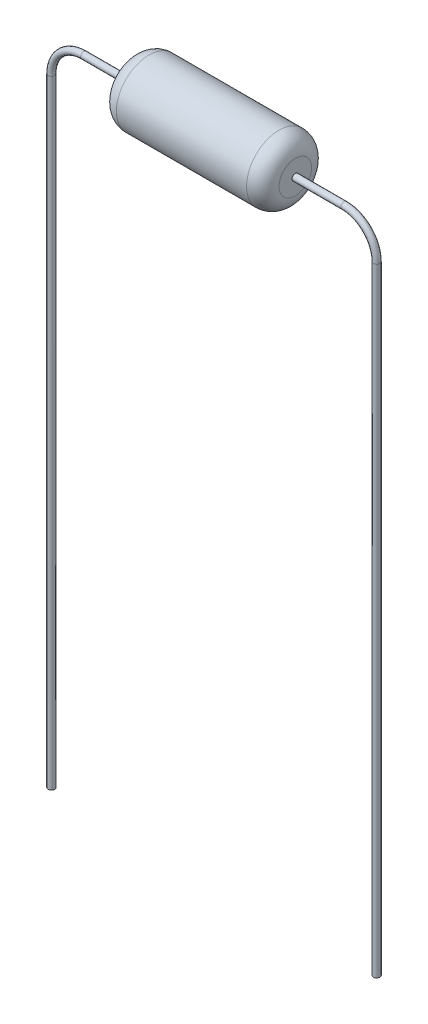
ISO-10303-21;
HEADER;
FILE_DESCRIPTION(('STEP AP214'),'2;1');
FILE_NAME('part.step','',(''),(''),'','','');
FILE_SCHEMA(('AUTOMOTIVE_DESIGN { 1 0 10303 214 1 1 1 1 }'));
ENDSEC;
DATA;
#1=APPLICATION_CONTEXT('core data for automotive mechanical design processes');
#2=APPLICATION_PROTOCOL_DEFINITION('international standard','automotive_design',2000,#1);
#3=PRODUCT_CONTEXT('',#1,'mechanical');
#4=PRODUCT('Part','Part','',(#3));
#5=PRODUCT_RELATED_PRODUCT_CATEGORY('part','',(#4));
#6=PRODUCT_DEFINITION_FORMATION('','',#4);
#7=PRODUCT_DEFINITION_CONTEXT('part definition',#1,'design');
#8=PRODUCT_DEFINITION('design','',#6,#7);
#9=PRODUCT_DEFINITION_SHAPE('','',#8);
#10=(LENGTH_UNIT() NAMED_UNIT(*) SI_UNIT(.MILLI.,.METRE.));
#11=(NAMED_UNIT(*) PLANE_ANGLE_UNIT() SI_UNIT($,.RADIAN.));
#12=(NAMED_UNIT(*) SI_UNIT($,.STERADIAN.) SOLID_ANGLE_UNIT());
#13=UNCERTAINTY_MEASURE_WITH_UNIT(LENGTH_MEASURE(1.E-05),#10,'distance_accuracy_value','');
#14=(GEOMETRIC_REPRESENTATION_CONTEXT(3) GLOBAL_UNCERTAINTY_ASSIGNED_CONTEXT((#13)) GLOBAL_UNIT_ASSIGNED_CONTEXT((#10,
#11,#12)) REPRESENTATION_CONTEXT('',''));
#15=CARTESIAN_POINT('',(0.,0.,0.));
#16=DIRECTION('',(0.,0.,1.));
#17=DIRECTION('',(1.,0.,0.));
#18=AXIS2_PLACEMENT_3D('',#15,#16,#17);
#19=CARTESIAN_POINT('',(-2.5,0.499999999999998,0.));
#20=DIRECTION('',(-1.,0.,0.));
#21=DIRECTION('',(0.,0.,1.));
#22=AXIS2_PLACEMENT_3D('',#19,#20,#21);
#23=PLANE('',#22);
#24=CARTESIAN_POINT('',(-2.5,0.,0.));
#25=DIRECTION('',(-1.,0.,0.));
#26=DIRECTION('',(0.,0.,1.));
#27=AXIS2_PLACEMENT_3D('',#24,#25,#26);
#28=CIRCLE('',#27,0.1);
#29=CARTESIAN_POINT('',(-2.5,0.,0.1));
#30=VERTEX_POINT('',#29);
#31=EDGE_CURVE('E10',#30,#30,#28,.T.);
#32=ORIENTED_EDGE('',*,*,#31,.F.);
#33=EDGE_LOOP('',(#32));
#34=FACE_BOUND('',#33,.T.);
#35=CARTESIAN_POINT('',(-2.5,0.,0.));
#36=DIRECTION('',(1.,0.,0.));
#37=DIRECTION('',(0.,0.,-1.));
#38=AXIS2_PLACEMENT_3D('',#35,#36,#37);
#39=CIRCLE('',#38,0.499999999999998);
#40=CARTESIAN_POINT('',(-2.5,0.,-0.499999999999998));
#41=VERTEX_POINT('',#40);
#42=EDGE_CURVE('E49',#41,#41,#39,.T.);
#43=ORIENTED_EDGE('',*,*,#42,.F.);
#44=EDGE_LOOP('',(#43));
#45=FACE_BOUND('',#44,.T.);
#46=ADVANCED_FACE('F37',(#34,#45),#23,.T.);
#47=CARTESIAN_POINT('',(-2.,0.,0.));
#48=DIRECTION('',(1.,0.,0.));
#49=DIRECTION('',(0.,0.,-1.));
#50=AXIS2_PLACEMENT_3D('',#47,#48,#49);
#51=DEGENERATE_TOROIDAL_SURFACE('',#50,0.499999999999998,0.5,.T.);
#52=ORIENTED_EDGE('',*,*,#42,.T.);
#53=EDGE_LOOP('',(#52));
#54=FACE_BOUND('',#53,.T.);
#55=CARTESIAN_POINT('',(-2.,0.,0.));
#56=DIRECTION('',(1.,0.,0.));
#57=DIRECTION('',(0.,0.,-1.));
#58=AXIS2_PLACEMENT_3D('',#55,#56,#57);
#59=CIRCLE('',#58,0.999999999999998);
#60=CARTESIAN_POINT('',(-2.,0.,-0.999999999999998));
#61=VERTEX_POINT('',#60);
#62=EDGE_CURVE('E54',#61,#61,#59,.T.);
#63=ORIENTED_EDGE('',*,*,#62,.F.);
#64=EDGE_LOOP('',(#63));
#65=FACE_BOUND('',#64,.T.);
#66=ADVANCED_FACE('F110',(#54,#65),#51,.T.);
#67=CARTESIAN_POINT('',(15.8505650117618,0.,0.));
#68=DIRECTION('',(1.,0.,0.));
#69=DIRECTION('',(0.,0.,-1.));
#70=AXIS2_PLACEMENT_3D('',#67,#68,#69);
#71=CYLINDRICAL_SURFACE('',#70,0.999999999999998);
#72=ORIENTED_EDGE('',*,*,#62,.T.);
#73=EDGE_LOOP('',(#72));
#74=FACE_BOUND('',#73,.T.);
#75=CARTESIAN_POINT('',(2.,0.,0.));
#76=DIRECTION('',(1.,0.,0.));
#77=DIRECTION('',(0.,0.,-1.));
#78=AXIS2_PLACEMENT_3D('',#75,#76,#77);
#79=CIRCLE('',#78,0.999999999999999);
#80=CARTESIAN_POINT('',(2.,0.,-0.999999999999999));
#81=VERTEX_POINT('',#80);
#82=EDGE_CURVE('E60',#81,#81,#79,.T.);
#83=ORIENTED_EDGE('',*,*,#82,.F.);
#84=EDGE_LOOP('',(#83));
#85=FACE_BOUND('',#84,.T.);
#86=ADVANCED_FACE('F115',(#74,#85),#71,.T.);
#87=CARTESIAN_POINT('',(2.,0.,0.));
#88=DIRECTION('',(1.,0.,0.));
#89=DIRECTION('',(0.,0.,-1.));
#90=AXIS2_PLACEMENT_3D('',#87,#88,#89);
#91=DEGENERATE_TOROIDAL_SURFACE('',#90,0.499999999999998,0.5,.T.);
#92=ORIENTED_EDGE('',*,*,#82,.T.);
#93=EDGE_LOOP('',(#92));
#94=FACE_BOUND('',#93,.T.);
#95=CARTESIAN_POINT('',(2.5,0.,0.));
#96=DIRECTION('',(1.,0.,0.));
#97=DIRECTION('',(0.,0.,-1.));
#98=AXIS2_PLACEMENT_3D('',#95,#96,#97);
#99=CIRCLE('',#98,0.499999999999998);
#100=CARTESIAN_POINT('',(2.5,0.,-0.499999999999998));
#101=VERTEX_POINT('',#100);
#102=EDGE_CURVE('E64',#101,#101,#99,.T.);
#103=ORIENTED_EDGE('',*,*,#102,.F.);
#104=EDGE_LOOP('',(#103));
#105=FACE_BOUND('',#104,.T.);
#106=ADVANCED_FACE('F124',(#94,#105),#91,.T.);
#107=CARTESIAN_POINT('',(2.5,0.,0.));
#108=DIRECTION('',(1.,0.,0.));
#109=DIRECTION('',(0.,0.,-1.));
#110=AXIS2_PLACEMENT_3D('',#107,#108,#109);
#111=PLANE('',#110);
#112=CARTESIAN_POINT('',(2.5,0.,0.));
#113=DIRECTION('',(1.,0.,0.));
#114=DIRECTION('',(0.,0.,-1.));
#115=AXIS2_PLACEMENT_3D('',#112,#113,#114);
#116=CIRCLE('',#115,0.1);
#117=CARTESIAN_POINT('',(2.5,0.,-0.1));
#118=VERTEX_POINT('',#117);
#119=EDGE_CURVE('E44',#118,#118,#116,.T.);
#120=ORIENTED_EDGE('',*,*,#119,.F.);
#121=EDGE_LOOP('',(#120));
#122=FACE_BOUND('',#121,.T.);
#123=ORIENTED_EDGE('',*,*,#102,.T.);
#124=EDGE_LOOP('',(#123));
#125=FACE_BOUND('',#124,.T.);
#126=ADVANCED_FACE('F130',(#122,#125),#111,.T.);
#127=CARTESIAN_POINT('',(5.,-20.,0.));
#128=DIRECTION('',(0.,-1.,0.));
#129=DIRECTION('',(0.,0.,-1.));
#130=AXIS2_PLACEMENT_3D('',#127,#128,#129);
#131=PLANE('',#130);
#132=CARTESIAN_POINT('',(5.,-20.,0.));
#133=DIRECTION('',(0.,-1.,0.));
#134=DIRECTION('',(0.,0.,-1.));
#135=AXIS2_PLACEMENT_3D('',#132,#133,#134);
#136=CIRCLE('',#135,0.1);
#137=CARTESIAN_POINT('',(5.,-20.,-0.1));
#138=VERTEX_POINT('',#137);
#139=EDGE_CURVE('E68',#138,#138,#136,.T.);
#140=ORIENTED_EDGE('',*,*,#139,.T.);
#141=EDGE_LOOP('',(#140));
#142=FACE_BOUND('',#141,.T.);
#143=ADVANCED_FACE('F135',(#142),#131,.T.);
#144=CARTESIAN_POINT('',(2.5,0.,0.));
#145=DIRECTION('',(1.,0.,0.));
#146=DIRECTION('',(0.,1.,0.));
#147=AXIS2_PLACEMENT_3D('',#144,#145,#146);
#148=CYLINDRICAL_SURFACE('',#147,0.1);
#149=CARTESIAN_POINT('',(4.,0.,0.));
#150=DIRECTION('',(1.,0.,0.));
#151=DIRECTION('',(0.,0.,-1.));
#152=AXIS2_PLACEMENT_3D('',#149,#150,#151);
#153=CIRCLE('',#152,0.1);
#154=CARTESIAN_POINT('',(4.,0.0999999999999996,0.));
#155=VERTEX_POINT('',#154);
#156=EDGE_CURVE('E76',#155,#155,#153,.T.);
#157=ORIENTED_EDGE('',*,*,#156,.F.);
#158=EDGE_LOOP('',(#157));
#159=FACE_BOUND('',#158,.T.);
#160=ORIENTED_EDGE('',*,*,#119,.T.);
#161=EDGE_LOOP('',(#160));
#162=FACE_BOUND('',#161,.T.);
#163=ADVANCED_FACE('F141',(#159,#162),#148,.T.);
#164=CARTESIAN_POINT('',(4.,-1.,0.));
#165=DIRECTION('',(0.,0.,-1.));
#166=DIRECTION('',(-1.,0.,0.));
#167=AXIS2_PLACEMENT_3D('',#164,#165,#166);
#168=TOROIDAL_SURFACE('',#167,1.,0.1);
#169=CARTESIAN_POINT('',(5.,-1.,0.));
#170=DIRECTION('',(0.,-1.,0.));
#171=DIRECTION('',(0.,0.,-1.));
#172=AXIS2_PLACEMENT_3D('',#169,#170,#171);
#173=CIRCLE('',#172,0.1);
#174=CARTESIAN_POINT('',(5.1,-1.,0.));
#175=VERTEX_POINT('',#174);
#176=EDGE_CURVE('E72',#175,#175,#173,.T.);
#177=CARTESIAN_POINT('',(4.,-1.,0.));
#178=DIRECTION('',(0.,0.,-1.));
#179=DIRECTION('',(-1.,0.,0.));
#180=AXIS2_PLACEMENT_3D('',#177,#178,#179);
#181=CIRCLE('',#180,1.1);
#182=EDGE_CURVE('',#155,#175,#181,.T.);
#183=ORIENTED_EDGE('',*,*,#156,.T.);
#184=ORIENTED_EDGE('',*,*,#176,.F.);
#185=ORIENTED_EDGE('',*,*,#182,.T.);
#186=ORIENTED_EDGE('',*,*,#182,.F.);
#187=EDGE_LOOP('',(#183,#185,#184,#186));
#188=FACE_BOUND('',#187,.T.);
#189=ADVANCED_FACE('F145',(#188),#168,.T.);
#190=CARTESIAN_POINT('',(5.,-1.,0.));
#191=DIRECTION('',(0.,-1.,0.));
#192=DIRECTION('',(1.,0.,0.));
#193=AXIS2_PLACEMENT_3D('',#190,#191,#192);
#194=CYLINDRICAL_SURFACE('',#193,0.1);
#195=ORIENTED_EDGE('',*,*,#139,.F.);
#196=EDGE_LOOP('',(#195));
#197=FACE_BOUND('',#196,.T.);
#198=ORIENTED_EDGE('',*,*,#176,.T.);
#199=EDGE_LOOP('',(#198));
#200=FACE_BOUND('',#199,.T.);
#201=ADVANCED_FACE('F106',(#197,#200),#194,.T.);
#202=CARTESIAN_POINT('',(-5.,-20.,0.));
#203=DIRECTION('',(0.,-1.,0.));
#204=DIRECTION('',(0.,0.,-1.));
#205=AXIS2_PLACEMENT_3D('',#202,#203,#204);
#206=PLANE('',#205);
#207=CARTESIAN_POINT('',(-5.,-20.,0.));
#208=DIRECTION('',(0.,1.,0.));
#209=DIRECTION('',(0.,0.,-1.));
#210=AXIS2_PLACEMENT_3D('',#207,#208,#209);
#211=CIRCLE('',#210,0.1);
#212=CARTESIAN_POINT('',(-5.,-20.,-0.1));
#213=VERTEX_POINT('',#212);
#214=EDGE_CURVE('E80',#213,#213,#211,.F.);
#215=ORIENTED_EDGE('',*,*,#214,.T.);
#216=EDGE_LOOP('',(#215));
#217=FACE_BOUND('',#216,.T.);
#218=ADVANCED_FACE('F97',(#217),#206,.T.);
#219=CARTESIAN_POINT('',(-2.5,0.,0.));
#220=DIRECTION('',(-1.,0.,0.));
#221=DIRECTION('',(0.,-1.,0.));
#222=AXIS2_PLACEMENT_3D('',#219,#220,#221);
#223=CYLINDRICAL_SURFACE('',#222,0.1);
#224=CARTESIAN_POINT('',(-4.,0.,0.));
#225=DIRECTION('',(1.,0.,0.));
#226=DIRECTION('',(0.,0.,-1.));
#227=AXIS2_PLACEMENT_3D('',#224,#225,#226);
#228=CIRCLE('',#227,0.1);
#229=CARTESIAN_POINT('',(-4.,0.0999999999999996,0.));
#230=VERTEX_POINT('',#229);
#231=EDGE_CURVE('E88',#230,#230,#228,.F.);
#232=ORIENTED_EDGE('',*,*,#231,.F.);
#233=EDGE_LOOP('',(#232));
#234=FACE_BOUND('',#233,.T.);
#235=ORIENTED_EDGE('',*,*,#31,.T.);
#236=EDGE_LOOP('',(#235));
#237=FACE_BOUND('',#236,.T.);
#238=ADVANCED_FACE('F95',(#234,#237),#223,.T.);
#239=CARTESIAN_POINT('',(-4.,-1.,0.));
#240=DIRECTION('',(0.,0.,1.));
#241=DIRECTION('',(1.,0.,0.));
#242=AXIS2_PLACEMENT_3D('',#239,#240,#241);
#243=TOROIDAL_SURFACE('',#242,1.,0.1);
#244=CARTESIAN_POINT('',(-5.,-1.,0.));
#245=DIRECTION('',(0.,1.,0.));
#246=DIRECTION('',(0.,0.,-1.));
#247=AXIS2_PLACEMENT_3D('',#244,#245,#246);
#248=CIRCLE('',#247,0.1);
#249=CARTESIAN_POINT('',(-5.1,-1.,0.));
#250=VERTEX_POINT('',#249);
#251=EDGE_CURVE('E84',#250,#250,#248,.F.);
#252=CARTESIAN_POINT('',(-4.,-1.,0.));
#253=DIRECTION('',(0.,0.,1.));
#254=DIRECTION('',(1.,0.,0.));
#255=AXIS2_PLACEMENT_3D('',#252,#253,#254);
#256=CIRCLE('',#255,1.1);
#257=EDGE_CURVE('',#230,#250,#256,.T.);
#258=ORIENTED_EDGE('',*,*,#231,.T.);
#259=ORIENTED_EDGE('',*,*,#251,.F.);
#260=ORIENTED_EDGE('',*,*,#257,.T.);
#261=ORIENTED_EDGE('',*,*,#257,.F.);
#262=EDGE_LOOP('',(#258,#260,#259,#261));
#263=FACE_BOUND('',#262,.T.);
#264=ADVANCED_FACE('F93',(#263),#243,.T.);
#265=CARTESIAN_POINT('',(-5.,-1.,0.));
#266=DIRECTION('',(0.,-1.,0.));
#267=DIRECTION('',(1.,0.,0.));
#268=AXIS2_PLACEMENT_3D('',#265,#266,#267);
#269=CYLINDRICAL_SURFACE('',#268,0.1);
#270=ORIENTED_EDGE('',*,*,#214,.F.);
#271=EDGE_LOOP('',(#270));
#272=FACE_BOUND('',#271,.T.);
#273=ORIENTED_EDGE('',*,*,#251,.T.);
#274=EDGE_LOOP('',(#273));
#275=FACE_BOUND('',#274,.T.);
#276=ADVANCED_FACE('F103',(#272,#275),#269,.T.);
#277=CLOSED_SHELL('',(#46,#66,#86,#106,#126,#143,#163,#189,#201,#218,#238,#264,#276));
#278=MANIFOLD_SOLID_BREP('B2',#277);
#279=ADVANCED_BREP_SHAPE_REPRESENTATION('',(#18,#278),#14);
#280=SHAPE_DEFINITION_REPRESENTATION(#9,#279);
ENDSEC;
END-ISO-10303-21;
